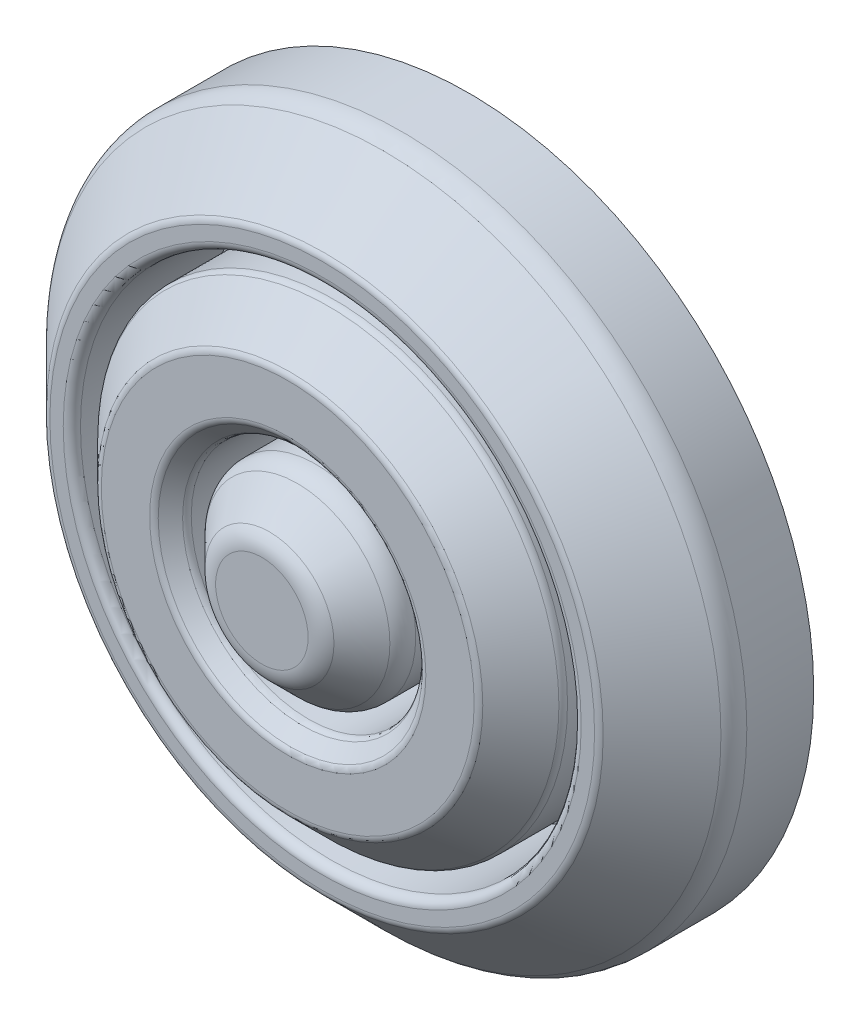
ISO-10303-21;
HEADER;
FILE_DESCRIPTION(('STEP AP214'),'2;1');
FILE_NAME('part.step','',(''),(''),'','','');
FILE_SCHEMA(('AUTOMOTIVE_DESIGN { 1 0 10303 214 1 1 1 1 }'));
ENDSEC;
DATA;
#1=APPLICATION_CONTEXT('core data for automotive mechanical design processes');
#2=APPLICATION_PROTOCOL_DEFINITION('international standard','automotive_design',2000,#1);
#3=PRODUCT_CONTEXT('',#1,'mechanical');
#4=PRODUCT('Part','Part','',(#3));
#5=PRODUCT_RELATED_PRODUCT_CATEGORY('part','',(#4));
#6=PRODUCT_DEFINITION_FORMATION('','',#4);
#7=PRODUCT_DEFINITION_CONTEXT('part definition',#1,'design');
#8=PRODUCT_DEFINITION('design','',#6,#7);
#9=PRODUCT_DEFINITION_SHAPE('','',#8);
#10=(LENGTH_UNIT() NAMED_UNIT(*) SI_UNIT(.MILLI.,.METRE.));
#11=(NAMED_UNIT(*) PLANE_ANGLE_UNIT() SI_UNIT($,.RADIAN.));
#12=(NAMED_UNIT(*) SI_UNIT($,.STERADIAN.) SOLID_ANGLE_UNIT());
#13=UNCERTAINTY_MEASURE_WITH_UNIT(LENGTH_MEASURE(1.E-05),#10,'distance_accuracy_value','');
#14=(GEOMETRIC_REPRESENTATION_CONTEXT(3) GLOBAL_UNCERTAINTY_ASSIGNED_CONTEXT((#13)) GLOBAL_UNIT_ASSIGNED_CONTEXT((#10,
#11,#12)) REPRESENTATION_CONTEXT('',''));
#15=CARTESIAN_POINT('',(0.,0.,0.));
#16=DIRECTION('',(0.,0.,1.));
#17=DIRECTION('',(1.,0.,0.));
#18=AXIS2_PLACEMENT_3D('',#15,#16,#17);
#19=CARTESIAN_POINT('',(0.,0.,-2.));
#20=DIRECTION('',(0.,0.,1.));
#21=DIRECTION('',(1.,0.,0.));
#22=AXIS2_PLACEMENT_3D('',#19,#20,#21);
#23=CYLINDRICAL_SURFACE('',#22,40.);
#24=CARTESIAN_POINT('',(0.,0.,5.7573593128807));
#25=DIRECTION('',(0.,0.,1.));
#26=DIRECTION('',(1.,0.,0.));
#27=AXIS2_PLACEMENT_3D('',#24,#25,#26);
#28=CIRCLE('',#27,40.);
#29=CARTESIAN_POINT('',(40.,0.,5.7573593128807));
#30=VERTEX_POINT('',#29);
#31=EDGE_CURVE('E49',#30,#30,#28,.F.);
#32=ORIENTED_EDGE('',*,*,#31,.T.);
#33=EDGE_LOOP('',(#32));
#34=FACE_BOUND('',#33,.T.);
#35=CARTESIAN_POINT('',(0.,0.,-2.));
#36=DIRECTION('',(0.,0.,1.));
#37=DIRECTION('',(1.,0.,0.));
#38=AXIS2_PLACEMENT_3D('',#35,#36,#37);
#39=CIRCLE('',#38,40.);
#40=CARTESIAN_POINT('',(40.,0.,-2.));
#41=VERTEX_POINT('',#40);
#42=EDGE_CURVE('E108',#41,#41,#39,.T.);
#43=ORIENTED_EDGE('',*,*,#42,.T.);
#44=EDGE_LOOP('',(#43));
#45=FACE_BOUND('',#44,.T.);
#46=ADVANCED_FACE('F43',(#34,#45),#23,.T.);
#47=CARTESIAN_POINT('',(0.,0.,-2.));
#48=DIRECTION('',(0.,0.,1.));
#49=DIRECTION('',(1.,0.,0.));
#50=AXIS2_PLACEMENT_3D('',#47,#48,#49);
#51=PLANE('',#50);
#52=CARTESIAN_POINT('',(0.,0.,-2.));
#53=DIRECTION('',(0.,0.,1.));
#54=DIRECTION('',(1.,0.,0.));
#55=AXIS2_PLACEMENT_3D('',#52,#53,#54);
#56=CIRCLE('',#55,39.);
#57=CARTESIAN_POINT('',(39.,0.,-2.));
#58=VERTEX_POINT('',#57);
#59=EDGE_CURVE('E122',#58,#58,#56,.T.);
#60=ORIENTED_EDGE('',*,*,#59,.T.);
#61=EDGE_LOOP('',(#60));
#62=FACE_BOUND('',#61,.T.);
#63=ORIENTED_EDGE('',*,*,#42,.F.);
#64=EDGE_LOOP('',(#63));
#65=FACE_BOUND('',#64,.T.);
#66=ADVANCED_FACE('F181',(#62,#65),#51,.F.);
#67=CARTESIAN_POINT('',(0.,0.,15.));
#68=DIRECTION('',(0.,0.,-1.));
#69=DIRECTION('',(-1.,0.,0.));
#70=AXIS2_PLACEMENT_3D('',#67,#68,#69);
#71=CYLINDRICAL_SURFACE('',#70,29.0369748827173);
#72=CARTESIAN_POINT('',(0.,0.,14.));
#73=DIRECTION('',(0.,0.,1.));
#74=DIRECTION('',(1.,0.,0.));
#75=AXIS2_PLACEMENT_3D('',#72,#73,#74);
#76=CIRCLE('',#75,29.0369748827173);
#77=CARTESIAN_POINT('',(29.0369748827173,0.,14.));
#78=VERTEX_POINT('',#77);
#79=EDGE_CURVE('E105',#78,#78,#76,.T.);
#80=ORIENTED_EDGE('',*,*,#79,.T.);
#81=EDGE_LOOP('',(#80));
#82=FACE_BOUND('',#81,.T.);
#83=CARTESIAN_POINT('',(0.,0.,0.));
#84=DIRECTION('',(0.,0.,1.));
#85=DIRECTION('',(1.,0.,0.));
#86=AXIS2_PLACEMENT_3D('',#83,#84,#85);
#87=CIRCLE('',#86,29.0369748827173);
#88=CARTESIAN_POINT('',(29.0369748827173,0.,0.));
#89=VERTEX_POINT('',#88);
#90=EDGE_CURVE('E111',#89,#89,#87,.T.);
#91=ORIENTED_EDGE('',*,*,#90,.F.);
#92=EDGE_LOOP('',(#91));
#93=FACE_BOUND('',#92,.T.);
#94=ADVANCED_FACE('F183',(#82,#93),#71,.F.);
#95=CARTESIAN_POINT('',(0.,0.,15.));
#96=DIRECTION('',(0.,0.,1.));
#97=DIRECTION('',(1.,0.,0.));
#98=AXIS2_PLACEMENT_3D('',#95,#96,#97);
#99=PLANE('',#98);
#100=CARTESIAN_POINT('',(0.,0.,15.));
#101=DIRECTION('',(0.,0.,1.));
#102=DIRECTION('',(1.,0.,0.));
#103=AXIS2_PLACEMENT_3D('',#100,#101,#102);
#104=CIRCLE('',#103,30.0369748827173);
#105=CARTESIAN_POINT('',(30.0369748827173,0.,15.));
#106=VERTEX_POINT('',#105);
#107=EDGE_CURVE('E98',#106,#106,#104,.F.);
#108=ORIENTED_EDGE('',*,*,#107,.T.);
#109=EDGE_LOOP('',(#108));
#110=FACE_BOUND('',#109,.T.);
#111=CARTESIAN_POINT('',(0.,0.,15.));
#112=DIRECTION('',(0.,0.,1.));
#113=DIRECTION('',(1.,0.,0.));
#114=AXIS2_PLACEMENT_3D('',#111,#112,#113);
#115=CIRCLE('',#114,31.5857864376269);
#116=CARTESIAN_POINT('',(31.5857864376269,0.,15.));
#117=VERTEX_POINT('',#116);
#118=EDGE_CURVE('E100',#117,#117,#115,.T.);
#119=ORIENTED_EDGE('',*,*,#118,.T.);
#120=EDGE_LOOP('',(#119));
#121=FACE_BOUND('',#120,.T.);
#122=ADVANCED_FACE('F284',(#110,#121),#99,.T.);
#123=CARTESIAN_POINT('',(0.,0.,0.));
#124=DIRECTION('',(0.,0.,1.));
#125=DIRECTION('',(1.,0.,0.));
#126=AXIS2_PLACEMENT_3D('',#123,#124,#125);
#127=PLANE('',#126);
#128=CARTESIAN_POINT('',(0.,0.,0.));
#129=DIRECTION('',(0.,0.,1.));
#130=DIRECTION('',(1.,0.,0.));
#131=AXIS2_PLACEMENT_3D('',#128,#129,#130);
#132=CIRCLE('',#131,27.0369748827173);
#133=CARTESIAN_POINT('',(27.0369748827173,0.,0.));
#134=VERTEX_POINT('',#133);
#135=EDGE_CURVE('E112',#134,#134,#132,.T.);
#136=ORIENTED_EDGE('',*,*,#135,.F.);
#137=EDGE_LOOP('',(#136));
#138=FACE_BOUND('',#137,.T.);
#139=ORIENTED_EDGE('',*,*,#90,.T.);
#140=EDGE_LOOP('',(#139));
#141=FACE_BOUND('',#140,.T.);
#142=ADVANCED_FACE('F198',(#138,#141),#127,.T.);
#143=CARTESIAN_POINT('',(0.,0.,19.));
#144=DIRECTION('',(0.,0.,-1.));
#145=DIRECTION('',(-1.,0.,0.));
#146=AXIS2_PLACEMENT_3D('',#143,#144,#145);
#147=CYLINDRICAL_SURFACE('',#146,13.6053721153909);
#148=CARTESIAN_POINT('',(0.,0.,16.5857864376269));
#149=DIRECTION('',(0.,0.,-1.));
#150=DIRECTION('',(-1.,0.,0.));
#151=AXIS2_PLACEMENT_3D('',#148,#149,#150);
#152=CIRCLE('',#151,13.6053721153909);
#153=CARTESIAN_POINT('',(-13.6053721153909,0.,16.5857864376269));
#154=VERTEX_POINT('',#153);
#155=EDGE_CURVE('E89',#154,#154,#152,.F.);
#156=ORIENTED_EDGE('',*,*,#155,.T.);
#157=EDGE_LOOP('',(#156));
#158=FACE_BOUND('',#157,.T.);
#159=CARTESIAN_POINT('',(0.,0.,0.));
#160=DIRECTION('',(0.,0.,1.));
#161=DIRECTION('',(1.,0.,0.));
#162=AXIS2_PLACEMENT_3D('',#159,#160,#161);
#163=CIRCLE('',#162,13.6053721153909);
#164=CARTESIAN_POINT('',(13.6053721153909,0.,0.));
#165=VERTEX_POINT('',#164);
#166=EDGE_CURVE('E102',#165,#165,#163,.F.);
#167=ORIENTED_EDGE('',*,*,#166,.T.);
#168=EDGE_LOOP('',(#167));
#169=FACE_BOUND('',#168,.T.);
#170=ADVANCED_FACE('F278',(#158,#169),#147,.F.);
#171=CARTESIAN_POINT('',(0.,0.,19.));
#172=DIRECTION('',(0.,0.,-1.));
#173=DIRECTION('',(-1.,0.,0.));
#174=AXIS2_PLACEMENT_3D('',#171,#172,#173);
#175=CYLINDRICAL_SURFACE('',#174,27.0369748827173);
#176=CARTESIAN_POINT('',(0.,0.,13.5857864376269));
#177=DIRECTION('',(0.,0.,1.));
#178=DIRECTION('',(1.,0.,0.));
#179=AXIS2_PLACEMENT_3D('',#176,#177,#178);
#180=CIRCLE('',#179,27.0369748827173);
#181=CARTESIAN_POINT('',(27.0369748827173,0.,13.5857864376269));
#182=VERTEX_POINT('',#181);
#183=EDGE_CURVE('E67',#182,#182,#180,.F.);
#184=ORIENTED_EDGE('',*,*,#183,.T.);
#185=EDGE_LOOP('',(#184));
#186=FACE_BOUND('',#185,.T.);
#187=ORIENTED_EDGE('',*,*,#135,.T.);
#188=EDGE_LOOP('',(#187));
#189=FACE_BOUND('',#188,.T.);
#190=ADVANCED_FACE('F277',(#186,#189),#175,.T.);
#191=CARTESIAN_POINT('',(0.,0.,19.));
#192=DIRECTION('',(0.,0.,1.));
#193=DIRECTION('',(1.,0.,0.));
#194=AXIS2_PLACEMENT_3D('',#191,#192,#193);
#195=PLANE('',#194);
#196=CARTESIAN_POINT('',(0.,0.,19.));
#197=DIRECTION('',(0.,0.,1.));
#198=DIRECTION('',(1.,0.,0.));
#199=AXIS2_PLACEMENT_3D('',#196,#197,#198);
#200=CIRCLE('',#199,16.019585677764);
#201=CARTESIAN_POINT('',(16.019585677764,0.,19.));
#202=VERTEX_POINT('',#201);
#203=EDGE_CURVE('E76',#202,#202,#200,.F.);
#204=ORIENTED_EDGE('',*,*,#203,.T.);
#205=EDGE_LOOP('',(#204));
#206=FACE_BOUND('',#205,.T.);
#207=CARTESIAN_POINT('',(0.,0.,19.));
#208=DIRECTION('',(0.,0.,1.));
#209=DIRECTION('',(1.,0.,0.));
#210=AXIS2_PLACEMENT_3D('',#207,#208,#209);
#211=CIRCLE('',#210,21.6227613203442);
#212=CARTESIAN_POINT('',(21.6227613203442,0.,19.));
#213=VERTEX_POINT('',#212);
#214=EDGE_CURVE('E82',#213,#213,#211,.T.);
#215=ORIENTED_EDGE('',*,*,#214,.T.);
#216=EDGE_LOOP('',(#215));
#217=FACE_BOUND('',#216,.T.);
#218=ADVANCED_FACE('F271',(#206,#217),#195,.T.);
#219=CARTESIAN_POINT('',(0.,0.,0.));
#220=DIRECTION('',(0.,0.,1.));
#221=DIRECTION('',(1.,0.,0.));
#222=AXIS2_PLACEMENT_3D('',#219,#220,#221);
#223=CIRCLE('',#222,11.6053721153909);
#224=CARTESIAN_POINT('',(11.6053721153909,0.,0.));
#225=VERTEX_POINT('',#224);
#226=EDGE_CURVE('E120',#225,#225,#223,.T.);
#227=ORIENTED_EDGE('',*,*,#226,.F.);
#228=EDGE_LOOP('',(#227));
#229=FACE_BOUND('',#228,.T.);
#230=ORIENTED_EDGE('',*,*,#166,.F.);
#231=EDGE_LOOP('',(#230));
#232=FACE_BOUND('',#231,.T.);
#233=ADVANCED_FACE('F269',(#229,#232),#127,.T.);
#234=CARTESIAN_POINT('',(0.,0.,22.));
#235=DIRECTION('',(0.,0.,-1.));
#236=DIRECTION('',(-1.,0.,0.));
#237=AXIS2_PLACEMENT_3D('',#234,#235,#236);
#238=CYLINDRICAL_SURFACE('',#237,11.6053721153909);
#239=CARTESIAN_POINT('',(0.,0.,15.7573593128807));
#240=DIRECTION('',(0.,0.,1.));
#241=DIRECTION('',(1.,0.,0.));
#242=AXIS2_PLACEMENT_3D('',#239,#240,#241);
#243=CIRCLE('',#242,11.6053721153909);
#244=CARTESIAN_POINT('',(11.6053721153909,0.,15.7573593128807));
#245=VERTEX_POINT('',#244);
#246=EDGE_CURVE('E68',#245,#245,#243,.F.);
#247=ORIENTED_EDGE('',*,*,#246,.T.);
#248=EDGE_LOOP('',(#247));
#249=FACE_BOUND('',#248,.T.);
#250=ORIENTED_EDGE('',*,*,#226,.T.);
#251=EDGE_LOOP('',(#250));
#252=FACE_BOUND('',#251,.T.);
#253=ADVANCED_FACE('F265',(#249,#252),#238,.T.);
#254=CARTESIAN_POINT('',(0.,0.,22.));
#255=DIRECTION('',(0.,0.,1.));
#256=DIRECTION('',(1.,0.,0.));
#257=AXIS2_PLACEMENT_3D('',#254,#255,#256);
#258=PLANE('',#257);
#259=CARTESIAN_POINT('',(0.,0.,22.));
#260=DIRECTION('',(0.,0.,1.));
#261=DIRECTION('',(1.,0.,0.));
#262=AXIS2_PLACEMENT_3D('',#259,#260,#261);
#263=CIRCLE('',#262,5.36273142827156);
#264=CARTESIAN_POINT('',(5.36273142827156,0.,22.));
#265=VERTEX_POINT('',#264);
#266=EDGE_CURVE('E53',#265,#265,#263,.T.);
#267=ORIENTED_EDGE('',*,*,#266,.T.);
#268=EDGE_LOOP('',(#267));
#269=FACE_BOUND('',#268,.T.);
#270=ADVANCED_FACE('F201',(#269),#258,.T.);
#271=CARTESIAN_POINT('',(0.,0.,15.));
#272=DIRECTION('',(0.,0.,-1.));
#273=DIRECTION('',(-1.,0.,0.));
#274=AXIS2_PLACEMENT_3D('',#271,#272,#273);
#275=CONICAL_SURFACE('',#274,32.,0.785398163397446);
#276=CARTESIAN_POINT('',(0.,0.,7.87867965644034));
#277=DIRECTION('',(0.,0.,1.));
#278=DIRECTION('',(1.,0.,0.));
#279=AXIS2_PLACEMENT_3D('',#276,#277,#278);
#280=CIRCLE('',#279,39.1213203435596);
#281=CARTESIAN_POINT('',(39.1213203435596,0.,7.87867965644034));
#282=VERTEX_POINT('',#281);
#283=EDGE_CURVE('E10',#282,#282,#280,.T.);
#284=ORIENTED_EDGE('',*,*,#283,.T.);
#285=EDGE_LOOP('',(#284));
#286=FACE_BOUND('',#285,.T.);
#287=CARTESIAN_POINT('',(0.,0.,14.7071067811865));
#288=DIRECTION('',(0.,0.,1.));
#289=DIRECTION('',(1.,0.,0.));
#290=AXIS2_PLACEMENT_3D('',#287,#288,#289);
#291=CIRCLE('',#290,32.2928932188135);
#292=CARTESIAN_POINT('',(32.2928932188135,0.,14.7071067811865));
#293=VERTEX_POINT('',#292);
#294=EDGE_CURVE('E95',#293,#293,#291,.F.);
#295=ORIENTED_EDGE('',*,*,#294,.T.);
#296=EDGE_LOOP('',(#295));
#297=FACE_BOUND('',#296,.T.);
#298=ADVANCED_FACE('F196',(#286,#297),#275,.T.);
#299=CARTESIAN_POINT('',(0.,0.,14.));
#300=DIRECTION('',(0.,0.,1.));
#301=DIRECTION('',(1.,0.,0.));
#302=AXIS2_PLACEMENT_3D('',#299,#300,#301);
#303=TOROIDAL_SURFACE('',#302,30.0369748827173,1.);
#304=ORIENTED_EDGE('',*,*,#107,.F.);
#305=EDGE_LOOP('',(#304));
#306=FACE_BOUND('',#305,.T.);
#307=ORIENTED_EDGE('',*,*,#79,.F.);
#308=EDGE_LOOP('',(#307));
#309=FACE_BOUND('',#308,.T.);
#310=ADVANCED_FACE('F205',(#306,#309),#303,.T.);
#311=CARTESIAN_POINT('',(0.,0.,14.));
#312=DIRECTION('',(0.,0.,1.));
#313=DIRECTION('',(1.,0.,0.));
#314=AXIS2_PLACEMENT_3D('',#311,#312,#313);
#315=TOROIDAL_SURFACE('',#314,31.5857864376269,1.);
#316=ORIENTED_EDGE('',*,*,#294,.F.);
#317=EDGE_LOOP('',(#316));
#318=FACE_BOUND('',#317,.T.);
#319=ORIENTED_EDGE('',*,*,#118,.F.);
#320=EDGE_LOOP('',(#319));
#321=FACE_BOUND('',#320,.T.);
#322=ADVANCED_FACE('F210',(#318,#321),#315,.T.);
#323=CARTESIAN_POINT('',(0.,0.,19.));
#324=DIRECTION('',(0.,0.,-1.));
#325=DIRECTION('',(-1.,0.,0.));
#326=AXIS2_PLACEMENT_3D('',#323,#324,#325);
#327=CONICAL_SURFACE('',#326,22.0369748827173,0.785398163397446);
#328=CARTESIAN_POINT('',(0.,0.,18.7071067811865));
#329=DIRECTION('',(0.,0.,1.));
#330=DIRECTION('',(1.,0.,0.));
#331=AXIS2_PLACEMENT_3D('',#328,#329,#330);
#332=CIRCLE('',#331,22.3298681015307);
#333=CARTESIAN_POINT('',(22.3298681015307,0.,18.7071067811865));
#334=VERTEX_POINT('',#333);
#335=EDGE_CURVE('E74',#334,#334,#332,.F.);
#336=ORIENTED_EDGE('',*,*,#335,.T.);
#337=EDGE_LOOP('',(#336));
#338=FACE_BOUND('',#337,.T.);
#339=CARTESIAN_POINT('',(0.,0.,14.2928932188134));
#340=DIRECTION('',(0.,0.,-1.));
#341=DIRECTION('',(-1.,0.,0.));
#342=AXIS2_PLACEMENT_3D('',#339,#340,#341);
#343=CIRCLE('',#342,26.7440816639038);
#344=CARTESIAN_POINT('',(-26.7440816639038,0.,14.2928932188134));
#345=VERTEX_POINT('',#344);
#346=EDGE_CURVE('E73',#345,#345,#343,.F.);
#347=ORIENTED_EDGE('',*,*,#346,.T.);
#348=EDGE_LOOP('',(#347));
#349=FACE_BOUND('',#348,.T.);
#350=ADVANCED_FACE('F212',(#338,#349),#327,.T.);
#351=CARTESIAN_POINT('',(0.,0.,17.));
#352=DIRECTION('',(0.,0.,1.));
#353=DIRECTION('',(1.,0.,0.));
#354=AXIS2_PLACEMENT_3D('',#351,#352,#353);
#355=CONICAL_SURFACE('',#354,13.6053721153909,0.78539816339745);
#356=CARTESIAN_POINT('',(0.,0.,17.2928932188135));
#357=DIRECTION('',(0.,0.,-1.));
#358=DIRECTION('',(-1.,0.,0.));
#359=AXIS2_PLACEMENT_3D('',#356,#357,#358);
#360=CIRCLE('',#359,13.8982653342043);
#361=CARTESIAN_POINT('',(-13.8982653342043,0.,17.2928932188135));
#362=VERTEX_POINT('',#361);
#363=EDGE_CURVE('E81',#362,#362,#360,.T.);
#364=ORIENTED_EDGE('',*,*,#363,.T.);
#365=EDGE_LOOP('',(#364));
#366=FACE_BOUND('',#365,.T.);
#367=CARTESIAN_POINT('',(0.,0.,18.7071067811865));
#368=DIRECTION('',(0.,0.,-1.));
#369=DIRECTION('',(-1.,0.,0.));
#370=AXIS2_PLACEMENT_3D('',#367,#368,#369);
#371=CIRCLE('',#370,15.3124788965774);
#372=CARTESIAN_POINT('',(-15.3124788965774,0.,18.7071067811865));
#373=VERTEX_POINT('',#372);
#374=EDGE_CURVE('E90',#373,#373,#371,.F.);
#375=ORIENTED_EDGE('',*,*,#374,.T.);
#376=EDGE_LOOP('',(#375));
#377=FACE_BOUND('',#376,.T.);
#378=ADVANCED_FACE('F216',(#366,#377),#355,.F.);
#379=CARTESIAN_POINT('',(0.,0.,16.5857864376269));
#380=DIRECTION('',(0.,0.,-1.));
#381=DIRECTION('',(-1.,0.,0.));
#382=AXIS2_PLACEMENT_3D('',#379,#380,#381);
#383=TOROIDAL_SURFACE('',#382,14.6053721153909,1.);
#384=ORIENTED_EDGE('',*,*,#363,.F.);
#385=EDGE_LOOP('',(#384));
#386=FACE_BOUND('',#385,.T.);
#387=ORIENTED_EDGE('',*,*,#155,.F.);
#388=EDGE_LOOP('',(#387));
#389=FACE_BOUND('',#388,.T.);
#390=ADVANCED_FACE('F223',(#386,#389),#383,.T.);
#391=CARTESIAN_POINT('',(0.,0.,18.));
#392=DIRECTION('',(0.,0.,1.));
#393=DIRECTION('',(1.,0.,0.));
#394=AXIS2_PLACEMENT_3D('',#391,#392,#393);
#395=TOROIDAL_SURFACE('',#394,16.019585677764,1.);
#396=ORIENTED_EDGE('',*,*,#374,.F.);
#397=EDGE_LOOP('',(#396));
#398=FACE_BOUND('',#397,.T.);
#399=ORIENTED_EDGE('',*,*,#203,.F.);
#400=EDGE_LOOP('',(#399));
#401=FACE_BOUND('',#400,.T.);
#402=ADVANCED_FACE('F230',(#398,#401),#395,.T.);
#403=CARTESIAN_POINT('',(0.,0.,18.));
#404=DIRECTION('',(0.,0.,1.));
#405=DIRECTION('',(1.,0.,0.));
#406=AXIS2_PLACEMENT_3D('',#403,#404,#405);
#407=TOROIDAL_SURFACE('',#406,21.6227613203442,1.);
#408=ORIENTED_EDGE('',*,*,#335,.F.);
#409=EDGE_LOOP('',(#408));
#410=FACE_BOUND('',#409,.T.);
#411=ORIENTED_EDGE('',*,*,#214,.F.);
#412=EDGE_LOOP('',(#411));
#413=FACE_BOUND('',#412,.T.);
#414=ADVANCED_FACE('F231',(#410,#413),#407,.T.);
#415=CARTESIAN_POINT('',(0.,0.,13.5857864376269));
#416=DIRECTION('',(0.,0.,1.));
#417=DIRECTION('',(1.,0.,0.));
#418=AXIS2_PLACEMENT_3D('',#415,#416,#417);
#419=TOROIDAL_SURFACE('',#418,26.0369748827173,1.);
#420=ORIENTED_EDGE('',*,*,#346,.F.);
#421=EDGE_LOOP('',(#420));
#422=FACE_BOUND('',#421,.T.);
#423=ORIENTED_EDGE('',*,*,#183,.F.);
#424=EDGE_LOOP('',(#423));
#425=FACE_BOUND('',#424,.T.);
#426=ADVANCED_FACE('F240',(#422,#425),#419,.T.);
#427=CARTESIAN_POINT('',(0.,0.,22.));
#428=DIRECTION('',(0.,0.,-1.));
#429=DIRECTION('',(-1.,0.,0.));
#430=AXIS2_PLACEMENT_3D('',#427,#428,#429);
#431=CONICAL_SURFACE('',#430,6.60537211539085,0.785398163397447);
#432=CARTESIAN_POINT('',(0.,0.,17.8786796564403));
#433=DIRECTION('',(0.,0.,-1.));
#434=DIRECTION('',(-1.,0.,0.));
#435=AXIS2_PLACEMENT_3D('',#432,#433,#434);
#436=CIRCLE('',#435,10.7266924589505);
#437=CARTESIAN_POINT('',(-10.7266924589505,0.,17.8786796564403));
#438=VERTEX_POINT('',#437);
#439=EDGE_CURVE('E59',#438,#438,#436,.F.);
#440=CARTESIAN_POINT('',(0.,0.,21.1213203435596));
#441=DIRECTION('',(0.,0.,1.));
#442=DIRECTION('',(1.,0.,0.));
#443=AXIS2_PLACEMENT_3D('',#440,#441,#442);
#444=CIRCLE('',#443,7.48405177183121);
#445=CARTESIAN_POINT('',(-7.48405177183121,0.,21.1213203435596));
#446=VERTEX_POINT('',#445);
#447=EDGE_CURVE('E64',#446,#446,#444,.F.);
#448=CARTESIAN_POINT('',(-10.7266924589505,0.,17.8786796564403));
#449=CARTESIAN_POINT('',(-10.692914951793,0.,17.9124571635978));
#450=CARTESIAN_POINT('',(-10.6591374446355,0.,17.9462346707553));
#451=CARTESIAN_POINT('',(-10.5915824303205,0.,18.0137896850703));
#452=CARTESIAN_POINT('',(-10.557804923163,0.,18.0475671922278));
#453=CARTESIAN_POINT('',(-10.4902499088481,0.,18.1151222065428));
#454=CARTESIAN_POINT('',(-10.4564724016906,0.,18.1488997137003));
#455=CARTESIAN_POINT('',(-10.3889173873756,0.,18.2164547280153));
#456=CARTESIAN_POINT('',(-10.3551398802181,0.,18.2502322351727));
#457=CARTESIAN_POINT('',(-10.2875848659031,0.,18.3177872494877));
#458=CARTESIAN_POINT('',(-10.2538073587456,0.,18.3515647566452));
#459=CARTESIAN_POINT('',(-10.1862523444306,0.,18.4191197709602));
#460=CARTESIAN_POINT('',(-10.1524748372731,0.,18.4528972781177));
#461=CARTESIAN_POINT('',(-10.0849198229581,0.,18.5204522924327));
#462=CARTESIAN_POINT('',(-10.0511423158007,0.,18.5542297995902));
#463=CARTESIAN_POINT('',(-9.98358730148567,0.,18.6217848139052));
#464=CARTESIAN_POINT('',(-9.94980979432817,0.,18.6555623210627));
#465=CARTESIAN_POINT('',(-9.88225478001319,0.,18.7231173353776));
#466=CARTESIAN_POINT('',(-9.8484772728557,0.,18.7568948425351));
#467=CARTESIAN_POINT('',(-9.78092225854071,0.,18.8244498568501));
#468=CARTESIAN_POINT('',(-9.74714475138322,0.,18.8582273640076));
#469=CARTESIAN_POINT('',(-9.67958973706823,0.,18.9257823783226));
#470=CARTESIAN_POINT('',(-9.64581222991074,0.,18.9595598854801));
#471=CARTESIAN_POINT('',(-9.57825721559576,0.,19.0271148997951));
#472=CARTESIAN_POINT('',(-9.54447970843826,0.,19.0608924069526));
#473=CARTESIAN_POINT('',(-9.47692469412327,0.,19.1284474212676));
#474=CARTESIAN_POINT('',(-9.44314718696578,0.,19.1622249284251));
#475=CARTESIAN_POINT('',(-9.3755921726508,0.,19.22977994274));
#476=CARTESIAN_POINT('',(-9.3418146654933,0.,19.2635574498975));
#477=CARTESIAN_POINT('',(-9.27425965117832,0.,19.3311124642125));
#478=CARTESIAN_POINT('',(-9.24048214402083,0.,19.36488997137));
#479=CARTESIAN_POINT('',(-9.17292712970584,0.,19.432444985685));
#480=CARTESIAN_POINT('',(-9.13914962254835,0.,19.4662224928425));
#481=CARTESIAN_POINT('',(-9.07159460823336,0.,19.5337775071575));
#482=CARTESIAN_POINT('',(-9.03781710107587,0.,19.567555014315));
#483=CARTESIAN_POINT('',(-8.97026208676089,0.,19.63511002863));
#484=CARTESIAN_POINT('',(-8.93648457960339,0.,19.6688875357874));
#485=CARTESIAN_POINT('',(-8.86892956528841,0.,19.7364425501024));
#486=CARTESIAN_POINT('',(-8.83515205813092,0.,19.7702200572599));
#487=CARTESIAN_POINT('',(-8.76759704381593,0.,19.8377750715749));
#488=CARTESIAN_POINT('',(-8.73381953665844,0.,19.8715525787324));
#489=CARTESIAN_POINT('',(-8.66626452234345,0.,19.9391075930474));
#490=CARTESIAN_POINT('',(-8.63248701518596,0.,19.9728851002049));
#491=CARTESIAN_POINT('',(-8.56493200087097,0.,20.0404401145199));
#492=CARTESIAN_POINT('',(-8.53115449371348,0.,20.0742176216774));
#493=CARTESIAN_POINT('',(-8.46359947939849,0.,20.1417726359923));
#494=CARTESIAN_POINT('',(-8.429821972241,0.,20.1755501431498));
#495=CARTESIAN_POINT('',(-8.36226695792602,0.,20.2431051574648));
#496=CARTESIAN_POINT('',(-8.32848945076852,0.,20.2768826646223));
#497=CARTESIAN_POINT('',(-8.26093443645354,0.,20.3444376789373));
#498=CARTESIAN_POINT('',(-8.22715692929605,0.,20.3782151860948));
#499=CARTESIAN_POINT('',(-8.15960191498106,0.,20.4457702004098));
#500=CARTESIAN_POINT('',(-8.12582440782357,0.,20.4795477075673));
#501=CARTESIAN_POINT('',(-8.05826939350858,0.,20.5471027218823));
#502=CARTESIAN_POINT('',(-8.02449188635109,0.,20.5808802290398));
#503=CARTESIAN_POINT('',(-7.9569368720361,0.,20.6484352433547));
#504=CARTESIAN_POINT('',(-7.92315936487861,0.,20.6822127505122));
#505=CARTESIAN_POINT('',(-7.85560435056363,0.,20.7497677648272));
#506=CARTESIAN_POINT('',(-7.82182684340614,0.,20.7835452719847));
#507=CARTESIAN_POINT('',(-7.75427182909115,0.,20.8511002862997));
#508=CARTESIAN_POINT('',(-7.72049432193366,0.,20.8848777934572));
#509=CARTESIAN_POINT('',(-7.65293930761867,0.,20.9524328077722));
#510=CARTESIAN_POINT('',(-7.61916180046118,0.,20.9862103149297));
#511=CARTESIAN_POINT('',(-7.55160678614619,0.,21.0537653292447));
#512=CARTESIAN_POINT('',(-7.5178292789887,0.,21.0875428364021));
#513=CARTESIAN_POINT('',(-7.48405177183121,0.,21.1213203435596));
#514=B_SPLINE_CURVE_WITH_KNOTS('',3,(#448,#449,#450,#451,#452,#453,#454,#455,#456,#457,#458,
#459,#460,#461,#462,#463,#464,#465,#466,#467,#468,#469,#470,#471,#472,#473,#474,#475,#476,#477,
#478,#479,#480,#481,#482,#483,#484,#485,#486,#487,#488,#489,#490,#491,#492,#493,#494,#495,#496,
#497,#498,#499,#500,#501,#502,#503,#504,#505,#506,#507,#508,#509,#510,#511,#512,#513),
.UNSPECIFIED.,.F.,.F.,(4,2,2,2,2,2,2,2,2,2,2,2,2,2,2,2,2,2,2,2,2,2,2,2,2,2,2,2,2,2,2,2,4),(0.,
0.143305826175839,0.286611652351681,0.429917478527523,0.573223304703365,0.716529130879206,
0.859834957055048,1.00314078323089,1.14644660940673,1.28975243558257,1.43305826175841,
1.57636408793426,1.7196699141101,1.86297574028594,2.00628156646178,2.14958739263762,
2.29289321881346,2.43619904498931,2.57950487116515,2.72281069734099,2.86611652351683,
3.00942234969267,3.15272817586851,3.29603400204435,3.4393398282202,3.58264565439604,
3.72595148057188,3.86925730674772,4.01256313292356,4.1558689590994,4.29917478527524,
4.44248061145109,4.58578643762693),.UNSPECIFIED.);
#515=EDGE_CURVE('BSEAM241',#438,#446,#514,.T.);
#516=ORIENTED_EDGE('',*,*,#439,.T.);
#517=ORIENTED_EDGE('',*,*,#447,.T.);
#518=ORIENTED_EDGE('',*,*,#515,.T.);
#519=ORIENTED_EDGE('',*,*,#515,.F.);
#520=EDGE_LOOP('',(#516,#518,#517,#519));
#521=FACE_BOUND('',#520,.T.);
#522=ADVANCED_FACE('F241',(#521),#431,.T.);
#523=CARTESIAN_POINT('',(0.,0.,15.7573593128807));
#524=DIRECTION('',(0.,0.,1.));
#525=DIRECTION('',(1.,0.,0.));
#526=AXIS2_PLACEMENT_3D('',#523,#524,#525);
#527=TOROIDAL_SURFACE('',#526,8.60537211539086,3.);
#528=ORIENTED_EDGE('',*,*,#439,.F.);
#529=EDGE_LOOP('',(#528));
#530=FACE_BOUND('',#529,.T.);
#531=ORIENTED_EDGE('',*,*,#246,.F.);
#532=EDGE_LOOP('',(#531));
#533=FACE_BOUND('',#532,.T.);
#534=ADVANCED_FACE('F250',(#530,#533),#527,.T.);
#535=CARTESIAN_POINT('',(0.,0.,19.));
#536=DIRECTION('',(0.,0.,1.));
#537=DIRECTION('',(1.,0.,0.));
#538=AXIS2_PLACEMENT_3D('',#535,#536,#537);
#539=TOROIDAL_SURFACE('',#538,5.36273142827156,3.);
#540=ORIENTED_EDGE('',*,*,#447,.F.);
#541=EDGE_LOOP('',(#540));
#542=FACE_BOUND('',#541,.T.);
#543=ORIENTED_EDGE('',*,*,#266,.F.);
#544=EDGE_LOOP('',(#543));
#545=FACE_BOUND('',#544,.T.);
#546=ADVANCED_FACE('F249',(#542,#545),#539,.T.);
#547=CARTESIAN_POINT('',(0.,0.,5.7573593128807));
#548=DIRECTION('',(0.,0.,1.));
#549=DIRECTION('',(1.,0.,0.));
#550=AXIS2_PLACEMENT_3D('',#547,#548,#549);
#551=TOROIDAL_SURFACE('',#550,37.,3.);
#552=ORIENTED_EDGE('',*,*,#283,.F.);
#553=EDGE_LOOP('',(#552));
#554=FACE_BOUND('',#553,.T.);
#555=ORIENTED_EDGE('',*,*,#31,.F.);
#556=EDGE_LOOP('',(#555));
#557=FACE_BOUND('',#556,.T.);
#558=ADVANCED_FACE('F44',(#554,#557),#551,.T.);
#559=CARTESIAN_POINT('',(0.,0.,-2.));
#560=DIRECTION('',(0.,0.,1.));
#561=DIRECTION('',(1.,0.,0.));
#562=AXIS2_PLACEMENT_3D('',#559,#560,#561);
#563=CYLINDRICAL_SURFACE('',#562,39.);
#564=CARTESIAN_POINT('',(0.,0.,5.7573593128807));
#565=DIRECTION('',(0.,0.,1.));
#566=DIRECTION('',(1.,0.,0.));
#567=AXIS2_PLACEMENT_3D('',#564,#565,#566);
#568=CIRCLE('',#567,39.);
#569=CARTESIAN_POINT('',(39.,0.,5.7573593128807));
#570=VERTEX_POINT('',#569);
#571=EDGE_CURVE('E126',#570,#570,#568,.F.);
#572=ORIENTED_EDGE('',*,*,#571,.F.);
#573=EDGE_LOOP('',(#572));
#574=FACE_BOUND('',#573,.T.);
#575=ORIENTED_EDGE('',*,*,#59,.F.);
#576=EDGE_LOOP('',(#575));
#577=FACE_BOUND('',#576,.T.);
#578=ADVANCED_FACE('F172',(#574,#577),#563,.F.);
#579=CARTESIAN_POINT('',(0.,0.,15.));
#580=DIRECTION('',(0.,0.,-1.));
#581=DIRECTION('',(-1.,0.,0.));
#582=AXIS2_PLACEMENT_3D('',#579,#580,#581);
#583=CYLINDRICAL_SURFACE('',#582,30.0369748827173);
#584=CARTESIAN_POINT('',(0.,0.,14.));
#585=DIRECTION('',(0.,0.,1.));
#586=DIRECTION('',(1.,0.,0.));
#587=AXIS2_PLACEMENT_3D('',#584,#585,#586);
#588=CIRCLE('',#587,30.0369748827173);
#589=CARTESIAN_POINT('',(30.0369748827173,0.,14.));
#590=VERTEX_POINT('',#589);
#591=EDGE_CURVE('E147',#590,#590,#588,.T.);
#592=ORIENTED_EDGE('',*,*,#591,.F.);
#593=EDGE_LOOP('',(#592));
#594=FACE_BOUND('',#593,.T.);
#595=CARTESIAN_POINT('',(0.,0.,-1.));
#596=DIRECTION('',(0.,0.,1.));
#597=DIRECTION('',(1.,0.,0.));
#598=AXIS2_PLACEMENT_3D('',#595,#596,#597);
#599=CIRCLE('',#598,30.0369748827173);
#600=CARTESIAN_POINT('',(30.0369748827173,0.,-1.));
#601=VERTEX_POINT('',#600);
#602=EDGE_CURVE('E123',#601,#601,#599,.T.);
#603=ORIENTED_EDGE('',*,*,#602,.T.);
#604=EDGE_LOOP('',(#603));
#605=FACE_BOUND('',#604,.T.);
#606=ADVANCED_FACE('F180',(#594,#605),#583,.T.);
#607=CARTESIAN_POINT('',(0.,0.,14.));
#608=DIRECTION('',(0.,0.,1.));
#609=DIRECTION('',(1.,0.,0.));
#610=AXIS2_PLACEMENT_3D('',#607,#608,#609);
#611=PLANE('',#610);
#612=ORIENTED_EDGE('',*,*,#591,.T.);
#613=EDGE_LOOP('',(#612));
#614=FACE_BOUND('',#613,.T.);
#615=CARTESIAN_POINT('',(0.,0.,14.));
#616=DIRECTION('',(0.,0.,1.));
#617=DIRECTION('',(1.,0.,0.));
#618=AXIS2_PLACEMENT_3D('',#615,#616,#617);
#619=CIRCLE('',#618,31.5857864376269);
#620=CARTESIAN_POINT('',(31.5857864376269,0.,14.));
#621=VERTEX_POINT('',#620);
#622=EDGE_CURVE('E153',#621,#621,#619,.T.);
#623=ORIENTED_EDGE('',*,*,#622,.F.);
#624=EDGE_LOOP('',(#623));
#625=FACE_BOUND('',#624,.T.);
#626=ADVANCED_FACE('F420',(#614,#625),#611,.F.);
#627=CARTESIAN_POINT('',(0.,0.,-1.));
#628=DIRECTION('',(0.,0.,1.));
#629=DIRECTION('',(1.,0.,0.));
#630=AXIS2_PLACEMENT_3D('',#627,#628,#629);
#631=PLANE('',#630);
#632=CARTESIAN_POINT('',(0.,0.,-1.));
#633=DIRECTION('',(0.,0.,1.));
#634=DIRECTION('',(1.,0.,0.));
#635=AXIS2_PLACEMENT_3D('',#632,#633,#634);
#636=CIRCLE('',#635,26.0369748827173);
#637=CARTESIAN_POINT('',(26.0369748827173,0.,-1.));
#638=VERTEX_POINT('',#637);
#639=EDGE_CURVE('E141',#638,#638,#636,.T.);
#640=ORIENTED_EDGE('',*,*,#639,.T.);
#641=EDGE_LOOP('',(#640));
#642=FACE_BOUND('',#641,.T.);
#643=ORIENTED_EDGE('',*,*,#602,.F.);
#644=EDGE_LOOP('',(#643));
#645=FACE_BOUND('',#644,.T.);
#646=ADVANCED_FACE('F430',(#642,#645),#631,.F.);
#647=CARTESIAN_POINT('',(0.,0.,19.));
#648=DIRECTION('',(0.,0.,-1.));
#649=DIRECTION('',(-1.,0.,0.));
#650=AXIS2_PLACEMENT_3D('',#647,#648,#649);
#651=CYLINDRICAL_SURFACE('',#650,14.6053721153909);
#652=CARTESIAN_POINT('',(0.,0.,16.5857864376269));
#653=DIRECTION('',(0.,0.,1.));
#654=DIRECTION('',(1.,0.,0.));
#655=AXIS2_PLACEMENT_3D('',#652,#653,#654);
#656=CIRCLE('',#655,14.6053721153909);
#657=CARTESIAN_POINT('',(14.6053721153909,0.,16.5857864376269));
#658=VERTEX_POINT('',#657);
#659=EDGE_CURVE('E150',#658,#658,#656,.T.);
#660=ORIENTED_EDGE('',*,*,#659,.F.);
#661=EDGE_LOOP('',(#660));
#662=FACE_BOUND('',#661,.T.);
#663=CARTESIAN_POINT('',(0.,0.,-1.));
#664=DIRECTION('',(0.,0.,1.));
#665=DIRECTION('',(1.,0.,0.));
#666=AXIS2_PLACEMENT_3D('',#663,#664,#665);
#667=CIRCLE('',#666,14.6053721153909);
#668=CARTESIAN_POINT('',(14.6053721153909,0.,-1.));
#669=VERTEX_POINT('',#668);
#670=EDGE_CURVE('E121',#669,#669,#667,.F.);
#671=ORIENTED_EDGE('',*,*,#670,.F.);
#672=EDGE_LOOP('',(#671));
#673=FACE_BOUND('',#672,.T.);
#674=ADVANCED_FACE('F436',(#662,#673),#651,.T.);
#675=CARTESIAN_POINT('',(0.,0.,19.));
#676=DIRECTION('',(0.,0.,-1.));
#677=DIRECTION('',(-1.,0.,0.));
#678=AXIS2_PLACEMENT_3D('',#675,#676,#677);
#679=CYLINDRICAL_SURFACE('',#678,26.0369748827173);
#680=CARTESIAN_POINT('',(0.,0.,13.5857864376269));
#681=DIRECTION('',(0.,0.,-1.));
#682=DIRECTION('',(-1.,0.,0.));
#683=AXIS2_PLACEMENT_3D('',#680,#681,#682);
#684=CIRCLE('',#683,26.0369748827173);
#685=CARTESIAN_POINT('',(-26.0369748827173,0.,13.5857864376269));
#686=VERTEX_POINT('',#685);
#687=EDGE_CURVE('E136',#686,#686,#684,.T.);
#688=ORIENTED_EDGE('',*,*,#687,.F.);
#689=EDGE_LOOP('',(#688));
#690=FACE_BOUND('',#689,.T.);
#691=ORIENTED_EDGE('',*,*,#639,.F.);
#692=EDGE_LOOP('',(#691));
#693=FACE_BOUND('',#692,.T.);
#694=ADVANCED_FACE('F447',(#690,#693),#679,.F.);
#695=CARTESIAN_POINT('',(0.,0.,18.));
#696=DIRECTION('',(0.,0.,1.));
#697=DIRECTION('',(1.,0.,0.));
#698=AXIS2_PLACEMENT_3D('',#695,#696,#697);
#699=PLANE('',#698);
#700=CARTESIAN_POINT('',(0.,0.,18.));
#701=DIRECTION('',(0.,0.,1.));
#702=DIRECTION('',(1.,0.,0.));
#703=AXIS2_PLACEMENT_3D('',#700,#701,#702);
#704=CIRCLE('',#703,16.019585677764);
#705=CARTESIAN_POINT('',(16.019585677764,0.,18.));
#706=VERTEX_POINT('',#705);
#707=EDGE_CURVE('E155',#706,#706,#704,.F.);
#708=ORIENTED_EDGE('',*,*,#707,.F.);
#709=EDGE_LOOP('',(#708));
#710=FACE_BOUND('',#709,.T.);
#711=CARTESIAN_POINT('',(0.,0.,18.));
#712=DIRECTION('',(0.,0.,1.));
#713=DIRECTION('',(1.,0.,0.));
#714=AXIS2_PLACEMENT_3D('',#711,#712,#713);
#715=CIRCLE('',#714,21.6227613203442);
#716=CARTESIAN_POINT('',(21.6227613203442,0.,18.));
#717=VERTEX_POINT('',#716);
#718=EDGE_CURVE('E148',#717,#717,#715,.T.);
#719=ORIENTED_EDGE('',*,*,#718,.F.);
#720=EDGE_LOOP('',(#719));
#721=FACE_BOUND('',#720,.T.);
#722=ADVANCED_FACE('F453',(#710,#721),#699,.F.);
#723=CARTESIAN_POINT('',(0.,0.,-1.));
#724=DIRECTION('',(0.,0.,1.));
#725=DIRECTION('',(1.,0.,0.));
#726=AXIS2_PLACEMENT_3D('',#723,#724,#725);
#727=CIRCLE('',#726,10.6053721153909);
#728=CARTESIAN_POINT('',(10.6053721153909,0.,-1.));
#729=VERTEX_POINT('',#728);
#730=EDGE_CURVE('E138',#729,#729,#727,.T.);
#731=ORIENTED_EDGE('',*,*,#730,.T.);
#732=EDGE_LOOP('',(#731));
#733=FACE_BOUND('',#732,.T.);
#734=ORIENTED_EDGE('',*,*,#670,.T.);
#735=EDGE_LOOP('',(#734));
#736=FACE_BOUND('',#735,.T.);
#737=ADVANCED_FACE('F437',(#733,#736),#631,.F.);
#738=CARTESIAN_POINT('',(0.,0.,22.));
#739=DIRECTION('',(0.,0.,-1.));
#740=DIRECTION('',(-1.,0.,0.));
#741=AXIS2_PLACEMENT_3D('',#738,#739,#740);
#742=CYLINDRICAL_SURFACE('',#741,10.6053721153909);
#743=CARTESIAN_POINT('',(0.,0.,15.7573593128807));
#744=DIRECTION('',(0.,0.,-1.));
#745=DIRECTION('',(-1.,0.,0.));
#746=AXIS2_PLACEMENT_3D('',#743,#744,#745);
#747=CIRCLE('',#746,10.6053721153909);
#748=CARTESIAN_POINT('',(-10.6053721153909,0.,15.7573593128807));
#749=VERTEX_POINT('',#748);
#750=EDGE_CURVE('E132',#749,#749,#747,.T.);
#751=ORIENTED_EDGE('',*,*,#750,.F.);
#752=EDGE_LOOP('',(#751));
#753=FACE_BOUND('',#752,.T.);
#754=ORIENTED_EDGE('',*,*,#730,.F.);
#755=EDGE_LOOP('',(#754));
#756=FACE_BOUND('',#755,.T.);
#757=ADVANCED_FACE('F475',(#753,#756),#742,.F.);
#758=CARTESIAN_POINT('',(0.,0.,21.));
#759=DIRECTION('',(0.,0.,1.));
#760=DIRECTION('',(1.,0.,0.));
#761=AXIS2_PLACEMENT_3D('',#758,#759,#760);
#762=PLANE('',#761);
#763=CARTESIAN_POINT('',(0.,0.,21.));
#764=DIRECTION('',(0.,0.,1.));
#765=DIRECTION('',(1.,0.,0.));
#766=AXIS2_PLACEMENT_3D('',#763,#764,#765);
#767=CIRCLE('',#766,5.36273142827156);
#768=CARTESIAN_POINT('',(5.36273142827156,0.,21.));
#769=VERTEX_POINT('',#768);
#770=EDGE_CURVE('E127',#769,#769,#767,.T.);
#771=ORIENTED_EDGE('',*,*,#770,.F.);
#772=EDGE_LOOP('',(#771));
#773=FACE_BOUND('',#772,.T.);
#774=ADVANCED_FACE('F479',(#773),#762,.F.);
#775=CARTESIAN_POINT('',(0.,0.,14.2928932188135));
#776=DIRECTION('',(0.,0.,-1.));
#777=DIRECTION('',(-1.,0.,0.));
#778=AXIS2_PLACEMENT_3D('',#775,#776,#777);
#779=CONICAL_SURFACE('',#778,31.2928932188135,0.785398163397446);
#780=CARTESIAN_POINT('',(0.,0.,7.17157287525379));
#781=DIRECTION('',(0.,0.,-1.));
#782=DIRECTION('',(-1.,0.,0.));
#783=AXIS2_PLACEMENT_3D('',#780,#781,#782);
#784=CIRCLE('',#783,38.4142135623731);
#785=CARTESIAN_POINT('',(-38.4142135623731,0.,7.17157287525379));
#786=VERTEX_POINT('',#785);
#787=EDGE_CURVE('E119',#786,#786,#784,.F.);
#788=ORIENTED_EDGE('',*,*,#787,.F.);
#789=EDGE_LOOP('',(#788));
#790=FACE_BOUND('',#789,.T.);
#791=ORIENTED_EDGE('',*,*,#622,.T.);
#792=EDGE_LOOP('',(#791));
#793=FACE_BOUND('',#792,.T.);
#794=ADVANCED_FACE('F490',(#790,#793),#779,.F.);
#795=CARTESIAN_POINT('',(0.,0.,18.2928932188135));
#796=DIRECTION('',(0.,0.,-1.));
#797=DIRECTION('',(-1.,0.,0.));
#798=AXIS2_PLACEMENT_3D('',#795,#796,#797);
#799=CONICAL_SURFACE('',#798,21.3298681015307,0.785398163397446);
#800=ORIENTED_EDGE('',*,*,#718,.T.);
#801=EDGE_LOOP('',(#800));
#802=FACE_BOUND('',#801,.T.);
#803=ORIENTED_EDGE('',*,*,#687,.T.);
#804=EDGE_LOOP('',(#803));
#805=FACE_BOUND('',#804,.T.);
#806=ADVANCED_FACE('F498',(#802,#805),#799,.F.);
#807=CARTESIAN_POINT('',(0.,0.,16.2928932188135));
#808=DIRECTION('',(0.,0.,1.));
#809=DIRECTION('',(1.,0.,0.));
#810=AXIS2_PLACEMENT_3D('',#807,#808,#809);
#811=CONICAL_SURFACE('',#810,14.3124788965774,0.78539816339745);
#812=ORIENTED_EDGE('',*,*,#659,.T.);
#813=EDGE_LOOP('',(#812));
#814=FACE_BOUND('',#813,.T.);
#815=ORIENTED_EDGE('',*,*,#707,.T.);
#816=EDGE_LOOP('',(#815));
#817=FACE_BOUND('',#816,.T.);
#818=ADVANCED_FACE('F510',(#814,#817),#811,.T.);
#819=CARTESIAN_POINT('',(0.,0.,21.2928932188135));
#820=DIRECTION('',(0.,0.,-1.));
#821=DIRECTION('',(-1.,0.,0.));
#822=AXIS2_PLACEMENT_3D('',#819,#820,#821);
#823=CONICAL_SURFACE('',#822,5.8982653342043,0.785398163397447);
#824=CARTESIAN_POINT('',(0.,0.,17.1715728752538));
#825=DIRECTION('',(0.,0.,-1.));
#826=DIRECTION('',(-1.,0.,0.));
#827=AXIS2_PLACEMENT_3D('',#824,#825,#826);
#828=CIRCLE('',#827,10.019585677764);
#829=CARTESIAN_POINT('',(-10.019585677764,0.,17.1715728752538));
#830=VERTEX_POINT('',#829);
#831=EDGE_CURVE('E128',#830,#830,#828,.F.);
#832=CARTESIAN_POINT('',(0.,0.,20.4142135623731));
#833=DIRECTION('',(0.,0.,-1.));
#834=DIRECTION('',(-1.,0.,0.));
#835=AXIS2_PLACEMENT_3D('',#832,#833,#834);
#836=CIRCLE('',#835,6.77694499064466);
#837=CARTESIAN_POINT('',(-6.77694499064466,0.,20.4142135623731));
#838=VERTEX_POINT('',#837);
#839=EDGE_CURVE('E133',#838,#838,#836,.T.);
#840=CARTESIAN_POINT('',(-10.019585677764,0.,17.1715728752538));
#841=CARTESIAN_POINT('',(-9.98580817060646,0.,17.2053503824113));
#842=CARTESIAN_POINT('',(-9.95203066344897,0.,17.2391278895688));
#843=CARTESIAN_POINT('',(-9.88447564913399,0.,17.3066829038838));
#844=CARTESIAN_POINT('',(-9.85069814197649,0.,17.3404604110412));
#845=CARTESIAN_POINT('',(-9.78314312766151,0.,17.4080154253562));
#846=CARTESIAN_POINT('',(-9.74936562050402,0.,17.4417929325137));
#847=CARTESIAN_POINT('',(-9.68181060618903,0.,17.5093479468287));
#848=CARTESIAN_POINT('',(-9.64803309903154,0.,17.5431254539862));
#849=CARTESIAN_POINT('',(-9.58047808471655,0.,17.6106804683012));
#850=CARTESIAN_POINT('',(-9.54670057755906,0.,17.6444579754587));
#851=CARTESIAN_POINT('',(-9.47914556324407,0.,17.7120129897737));
#852=CARTESIAN_POINT('',(-9.44536805608658,0.,17.7457904969312));
#853=CARTESIAN_POINT('',(-9.3778130417716,0.,17.8133455112461));
#854=CARTESIAN_POINT('',(-9.3440355346141,0.,17.8471230184036));
#855=CARTESIAN_POINT('',(-9.27648052029912,0.,17.9146780327186));
#856=CARTESIAN_POINT('',(-9.24270301314163,0.,17.9484555398761));
#857=CARTESIAN_POINT('',(-9.17514799882664,0.,18.0160105541911));
#858=CARTESIAN_POINT('',(-9.14137049166915,0.,18.0497880613486));
#859=CARTESIAN_POINT('',(-9.07381547735416,0.,18.1173430756636));
#860=CARTESIAN_POINT('',(-9.04003797019667,0.,18.1511205828211));
#861=CARTESIAN_POINT('',(-8.97248295588168,0.,18.2186755971361));
#862=CARTESIAN_POINT('',(-8.93870544872419,0.,18.2524531042936));
#863=CARTESIAN_POINT('',(-8.8711504344092,0.,18.3200081186085));
#864=CARTESIAN_POINT('',(-8.83737292725171,0.,18.353785625766));
#865=CARTESIAN_POINT('',(-8.76981791293673,0.,18.421340640081));
#866=CARTESIAN_POINT('',(-8.73604040577923,0.,18.4551181472385));
#867=CARTESIAN_POINT('',(-8.66848539146425,0.,18.5226731615535));
#868=CARTESIAN_POINT('',(-8.63470788430676,0.,18.556450668711));
#869=CARTESIAN_POINT('',(-8.56715286999177,0.,18.624005683026));
#870=CARTESIAN_POINT('',(-8.53337536283428,0.,18.6577831901835));
#871=CARTESIAN_POINT('',(-8.46582034851929,0.,18.7253382044985));
#872=CARTESIAN_POINT('',(-8.4320428413618,0.,18.7591157116559));
#873=CARTESIAN_POINT('',(-8.36448782704682,0.,18.8266707259709));
#874=CARTESIAN_POINT('',(-8.33071031988932,0.,18.8604482331284));
#875=CARTESIAN_POINT('',(-8.26315530557434,0.,18.9280032474434));
#876=CARTESIAN_POINT('',(-8.22937779841685,0.,18.9617807546009));
#877=CARTESIAN_POINT('',(-8.16182278410186,0.,19.0293357689159));
#878=CARTESIAN_POINT('',(-8.12804527694437,0.,19.0631132760734));
#879=CARTESIAN_POINT('',(-8.06049026262938,0.,19.1306682903884));
#880=CARTESIAN_POINT('',(-8.02671275547189,0.,19.1644457975459));
#881=CARTESIAN_POINT('',(-7.9591577411569,0.,19.2320008118608));
#882=CARTESIAN_POINT('',(-7.92538023399941,0.,19.2657783190183));
#883=CARTESIAN_POINT('',(-7.85782521968442,0.,19.3333333333333));
#884=CARTESIAN_POINT('',(-7.82404771252693,0.,19.3671108404908));
#885=CARTESIAN_POINT('',(-7.75649269821194,0.,19.4346658548058));
#886=CARTESIAN_POINT('',(-7.72271519105445,0.,19.4684433619633));
#887=CARTESIAN_POINT('',(-7.65516017673947,0.,19.5359983762783));
#888=CARTESIAN_POINT('',(-7.62138266958197,0.,19.5697758834358));
#889=CARTESIAN_POINT('',(-7.55382765526699,0.,19.6373308977508));
#890=CARTESIAN_POINT('',(-7.5200501481095,0.,19.6711084049083));
#891=CARTESIAN_POINT('',(-7.45249513379451,0.,19.7386634192232));
#892=CARTESIAN_POINT('',(-7.41871762663702,0.,19.7724409263807));
#893=CARTESIAN_POINT('',(-7.35116261232203,0.,19.8399959406957));
#894=CARTESIAN_POINT('',(-7.31738510516454,0.,19.8737734478532));
#895=CARTESIAN_POINT('',(-7.24983009084955,0.,19.9413284621682));
#896=CARTESIAN_POINT('',(-7.21605258369206,0.,19.9751059693257));
#897=CARTESIAN_POINT('',(-7.14849756937708,0.,20.0426609836407));
#898=CARTESIAN_POINT('',(-7.11472006221958,0.,20.0764384907982));
#899=CARTESIAN_POINT('',(-7.0471650479046,0.,20.1439935051132));
#900=CARTESIAN_POINT('',(-7.01338754074711,0.,20.1777710122706));
#901=CARTESIAN_POINT('',(-6.94583252643212,0.,20.2453260265856));
#902=CARTESIAN_POINT('',(-6.91205501927463,0.,20.2791035337431));
#903=CARTESIAN_POINT('',(-6.84450000495964,0.,20.3466585480581));
#904=CARTESIAN_POINT('',(-6.81072249780215,0.,20.3804360552156));
#905=CARTESIAN_POINT('',(-6.77694499064466,0.,20.4142135623731));
#906=B_SPLINE_CURVE_WITH_KNOTS('',3,(#840,#841,#842,#843,#844,#845,#846,#847,#848,#849,#850,
#851,#852,#853,#854,#855,#856,#857,#858,#859,#860,#861,#862,#863,#864,#865,#866,#867,#868,#869,
#870,#871,#872,#873,#874,#875,#876,#877,#878,#879,#880,#881,#882,#883,#884,#885,#886,#887,#888,
#889,#890,#891,#892,#893,#894,#895,#896,#897,#898,#899,#900,#901,#902,#903,#904,#905),
.UNSPECIFIED.,.F.,.F.,(4,2,2,2,2,2,2,2,2,2,2,2,2,2,2,2,2,2,2,2,2,2,2,2,2,2,2,2,2,2,2,2,4),(0.,
0.143305826175843,0.286611652351681,0.429917478527523,0.573223304703365,0.716529130879208,
0.859834957055049,1.00314078323089,1.14644660940673,1.28975243558258,1.43305826175842,
1.57636408793426,1.7196699141101,1.86297574028594,2.00628156646178,2.14958739263763,
2.29289321881347,2.43619904498931,2.57950487116515,2.72281069734099,2.86611652351683,
3.00942234969267,3.15272817586852,3.29603400204436,3.4393398282202,3.58264565439604,
3.72595148057188,3.86925730674772,4.01256313292357,4.15586895909941,4.29917478527525,
4.44248061145109,4.58578643762693),.UNSPECIFIED.);
#907=EDGE_CURVE('BSEAM517',#830,#838,#906,.T.);
#908=ORIENTED_EDGE('',*,*,#831,.F.);
#909=ORIENTED_EDGE('',*,*,#839,.F.);
#910=ORIENTED_EDGE('',*,*,#907,.T.);
#911=ORIENTED_EDGE('',*,*,#907,.F.);
#912=EDGE_LOOP('',(#908,#910,#909,#911));
#913=FACE_BOUND('',#912,.T.);
#914=ADVANCED_FACE('F517',(#913),#823,.F.);
#915=CARTESIAN_POINT('',(0.,0.,15.7573593128807));
#916=DIRECTION('',(0.,0.,1.));
#917=DIRECTION('',(1.,0.,0.));
#918=AXIS2_PLACEMENT_3D('',#915,#916,#917);
#919=TOROIDAL_SURFACE('',#918,8.60537211539086,2.);
#920=ORIENTED_EDGE('',*,*,#831,.T.);
#921=EDGE_LOOP('',(#920));
#922=FACE_BOUND('',#921,.T.);
#923=ORIENTED_EDGE('',*,*,#750,.T.);
#924=EDGE_LOOP('',(#923));
#925=FACE_BOUND('',#924,.T.);
#926=ADVANCED_FACE('F524',(#922,#925),#919,.F.);
#927=CARTESIAN_POINT('',(0.,0.,19.));
#928=DIRECTION('',(0.,0.,1.));
#929=DIRECTION('',(1.,0.,0.));
#930=AXIS2_PLACEMENT_3D('',#927,#928,#929);
#931=TOROIDAL_SURFACE('',#930,5.36273142827156,2.);
#932=ORIENTED_EDGE('',*,*,#839,.T.);
#933=EDGE_LOOP('',(#932));
#934=FACE_BOUND('',#933,.T.);
#935=ORIENTED_EDGE('',*,*,#770,.T.);
#936=EDGE_LOOP('',(#935));
#937=FACE_BOUND('',#936,.T.);
#938=ADVANCED_FACE('F534',(#934,#937),#931,.F.);
#939=CARTESIAN_POINT('',(0.,0.,5.7573593128807));
#940=DIRECTION('',(0.,0.,1.));
#941=DIRECTION('',(1.,0.,0.));
#942=AXIS2_PLACEMENT_3D('',#939,#940,#941);
#943=TOROIDAL_SURFACE('',#942,37.,2.);
#944=ORIENTED_EDGE('',*,*,#787,.T.);
#945=EDGE_LOOP('',(#944));
#946=FACE_BOUND('',#945,.T.);
#947=ORIENTED_EDGE('',*,*,#571,.T.);
#948=EDGE_LOOP('',(#947));
#949=FACE_BOUND('',#948,.T.);
#950=ADVANCED_FACE('F175',(#946,#949),#943,.F.);
#951=CLOSED_SHELL('',(#46,#66,#94,#122,#142,#170,#190,#218,#233,#253,#270,#298,#310,#322,#350,
#378,#390,#402,#414,#426,#522,#534,#546,#558,#578,#606,#626,#646,#674,#694,#722,#737,#757,#774,
#794,#806,#818,#914,#926,#938,#950));
#952=MANIFOLD_SOLID_BREP('B2',#951);
#953=ADVANCED_BREP_SHAPE_REPRESENTATION('',(#18,#952),#14);
#954=SHAPE_DEFINITION_REPRESENTATION(#9,#953);
ENDSEC;
END-ISO-10303-21;
